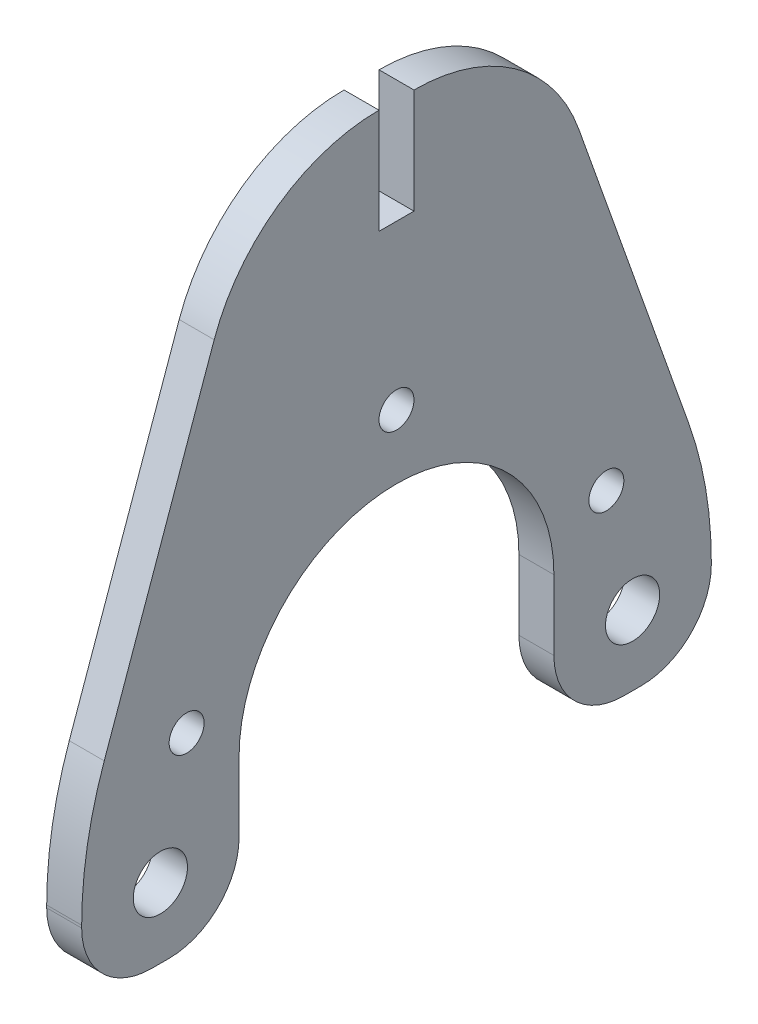
ISO-10303-21;
HEADER;
FILE_DESCRIPTION(('STEP AP214'),'2;1');
FILE_NAME('part.step','',(''),(''),'','','');
FILE_SCHEMA(('AUTOMOTIVE_DESIGN { 1 0 10303 214 1 1 1 1 }'));
ENDSEC;
DATA;
#1=APPLICATION_CONTEXT('core data for automotive mechanical design processes');
#2=APPLICATION_PROTOCOL_DEFINITION('international standard','automotive_design',2000,#1);
#3=PRODUCT_CONTEXT('',#1,'mechanical');
#4=PRODUCT('Part','Part','',(#3));
#5=PRODUCT_RELATED_PRODUCT_CATEGORY('part','',(#4));
#6=PRODUCT_DEFINITION_FORMATION('','',#4);
#7=PRODUCT_DEFINITION_CONTEXT('part definition',#1,'design');
#8=PRODUCT_DEFINITION('design','',#6,#7);
#9=PRODUCT_DEFINITION_SHAPE('','',#8);
#10=(LENGTH_UNIT() NAMED_UNIT(*) SI_UNIT(.MILLI.,.METRE.));
#11=(NAMED_UNIT(*) PLANE_ANGLE_UNIT() SI_UNIT($,.RADIAN.));
#12=(NAMED_UNIT(*) SI_UNIT($,.STERADIAN.) SOLID_ANGLE_UNIT());
#13=UNCERTAINTY_MEASURE_WITH_UNIT(LENGTH_MEASURE(1.E-05),#10,'distance_accuracy_value','');
#14=(GEOMETRIC_REPRESENTATION_CONTEXT(3) GLOBAL_UNCERTAINTY_ASSIGNED_CONTEXT((#13)) GLOBAL_UNIT_ASSIGNED_CONTEXT((#10,
#11,#12)) REPRESENTATION_CONTEXT('',''));
#15=CARTESIAN_POINT('',(0.,0.,0.));
#16=DIRECTION('',(0.,0.,1.));
#17=DIRECTION('',(1.,0.,0.));
#18=AXIS2_PLACEMENT_3D('',#15,#16,#17);
#19=CARTESIAN_POINT('',(3.175,0.,0.));
#20=DIRECTION('',(-1.,0.,0.));
#21=DIRECTION('',(0.,0.,1.));
#22=AXIS2_PLACEMENT_3D('',#19,#20,#21);
#23=CYLINDRICAL_SURFACE('',#22,14.2875);
#24=CARTESIAN_POINT('',(0.,0.,0.));
#25=DIRECTION('',(-1.,0.,0.));
#26=DIRECTION('',(0.,0.,-1.));
#27=AXIS2_PLACEMENT_3D('',#24,#25,#26);
#28=CIRCLE('',#27,14.2875);
#29=CARTESIAN_POINT('',(0.,0.,14.2875));
#30=VERTEX_POINT('',#29);
#31=CARTESIAN_POINT('',(0.,0.,-14.2875));
#32=VERTEX_POINT('',#31);
#33=EDGE_CURVE('E197',#30,#32,#28,.T.);
#34=ORIENTED_EDGE('',*,*,#33,.T.);
#35=DIRECTION('',(-1.,0.,0.));
#36=VECTOR('',#35,1.);
#37=CARTESIAN_POINT('',(3.175,0.,-14.2875));
#38=LINE('',#37,#36);
#39=CARTESIAN_POINT('',(3.175,0.,-14.2875));
#40=VERTEX_POINT('',#39);
#41=EDGE_CURVE('E181',#40,#32,#38,.T.);
#42=ORIENTED_EDGE('',*,*,#41,.F.);
#43=CARTESIAN_POINT('',(3.175,0.,0.));
#44=DIRECTION('',(-1.,0.,0.));
#45=DIRECTION('',(0.,0.,-1.));
#46=AXIS2_PLACEMENT_3D('',#43,#44,#45);
#47=CIRCLE('',#46,14.2875);
#48=CARTESIAN_POINT('',(3.175,0.,14.2875));
#49=VERTEX_POINT('',#48);
#50=EDGE_CURVE('E185',#49,#40,#47,.T.);
#51=ORIENTED_EDGE('',*,*,#50,.F.);
#52=DIRECTION('',(-1.,0.,0.));
#53=VECTOR('',#52,1.);
#54=CARTESIAN_POINT('',(3.175,0.,14.2875));
#55=LINE('',#54,#53);
#56=EDGE_CURVE('E289',#49,#30,#55,.T.);
#57=ORIENTED_EDGE('',*,*,#56,.T.);
#58=EDGE_LOOP('',(#34,#42,#51,#57));
#59=FACE_BOUND('',#58,.T.);
#60=ADVANCED_FACE('F40',(#59),#23,.F.);
#61=CARTESIAN_POINT('',(3.175,-12.7,-14.2875));
#62=DIRECTION('',(0.,0.,-1.));
#63=DIRECTION('',(0.,1.,0.));
#64=AXIS2_PLACEMENT_3D('',#61,#62,#63);
#65=PLANE('',#64);
#66=DIRECTION('',(0.,-1.,0.));
#67=VECTOR('',#66,1.);
#68=CARTESIAN_POINT('',(0.,-12.7,-14.2875));
#69=LINE('',#68,#67);
#70=CARTESIAN_POINT('',(0.,-6.35,-14.2875));
#71=VERTEX_POINT('',#70);
#72=EDGE_CURVE('E472',#32,#71,#69,.T.);
#73=ORIENTED_EDGE('',*,*,#72,.T.);
#74=DIRECTION('',(-1.,0.,0.));
#75=VECTOR('',#74,1.);
#76=CARTESIAN_POINT('',(3.175,-6.35,-14.2875));
#77=LINE('',#76,#75);
#78=CARTESIAN_POINT('',(3.175,-6.35,-14.2875));
#79=VERTEX_POINT('',#78);
#80=EDGE_CURVE('E55',#71,#79,#77,.F.);
#81=ORIENTED_EDGE('',*,*,#80,.T.);
#82=DIRECTION('',(0.,-1.,0.));
#83=VECTOR('',#82,1.);
#84=CARTESIAN_POINT('',(3.175,-12.7,-14.2875));
#85=LINE('',#84,#83);
#86=EDGE_CURVE('E177',#40,#79,#85,.T.);
#87=ORIENTED_EDGE('',*,*,#86,.F.);
#88=ORIENTED_EDGE('',*,*,#41,.T.);
#89=EDGE_LOOP('',(#73,#81,#87,#88));
#90=FACE_BOUND('',#89,.T.);
#91=ADVANCED_FACE('F179',(#90),#65,.F.);
#92=CARTESIAN_POINT('',(3.175,-12.7,-28.575));
#93=DIRECTION('',(0.,1.,0.));
#94=DIRECTION('',(0.,0.,1.));
#95=AXIS2_PLACEMENT_3D('',#92,#93,#94);
#96=PLANE('',#95);
#97=DIRECTION('',(0.,0.,-1.));
#98=VECTOR('',#97,1.);
#99=CARTESIAN_POINT('',(0.,-12.7,-28.575));
#100=LINE('',#99,#98);
#101=CARTESIAN_POINT('',(0.,-12.7,-20.6375));
#102=VERTEX_POINT('',#101);
#103=CARTESIAN_POINT('',(0.,-12.7,-22.225));
#104=VERTEX_POINT('',#103);
#105=EDGE_CURVE('E474',#102,#104,#100,.T.);
#106=ORIENTED_EDGE('',*,*,#105,.T.);
#107=DIRECTION('',(-1.,0.,0.));
#108=VECTOR('',#107,1.);
#109=CARTESIAN_POINT('',(3.175,-12.7,-22.225));
#110=LINE('',#109,#108);
#111=CARTESIAN_POINT('',(3.175,-12.7,-22.225));
#112=VERTEX_POINT('',#111);
#113=EDGE_CURVE('E239',#104,#112,#110,.F.);
#114=ORIENTED_EDGE('',*,*,#113,.T.);
#115=DIRECTION('',(0.,0.,-1.));
#116=VECTOR('',#115,1.);
#117=CARTESIAN_POINT('',(3.175,-12.7,-28.575));
#118=LINE('',#117,#116);
#119=CARTESIAN_POINT('',(3.175,-12.7,-20.6375));
#120=VERTEX_POINT('',#119);
#121=EDGE_CURVE('E184',#120,#112,#118,.T.);
#122=ORIENTED_EDGE('',*,*,#121,.F.);
#123=DIRECTION('',(-1.,0.,0.));
#124=VECTOR('',#123,1.);
#125=CARTESIAN_POINT('',(3.175,-12.7,-20.6375));
#126=LINE('',#125,#124);
#127=EDGE_CURVE('E236',#120,#102,#126,.T.);
#128=ORIENTED_EDGE('',*,*,#127,.T.);
#129=EDGE_LOOP('',(#106,#114,#122,#128));
#130=FACE_BOUND('',#129,.T.);
#131=ADVANCED_FACE('F357',(#130),#96,.F.);
#132=CARTESIAN_POINT('',(3.175,0.,-28.575));
#133=DIRECTION('',(0.,0.,1.));
#134=DIRECTION('',(0.,-1.,0.));
#135=AXIS2_PLACEMENT_3D('',#132,#133,#134);
#136=PLANE('',#135);
#137=DIRECTION('',(0.,1.,0.));
#138=VECTOR('',#137,1.);
#139=CARTESIAN_POINT('',(3.175,0.,-28.575));
#140=LINE('',#139,#138);
#141=CARTESIAN_POINT('',(3.175,-6.35,-28.575));
#142=VERTEX_POINT('',#141);
#143=CARTESIAN_POINT('',(3.175,-6.12356805758089,-28.575));
#144=VERTEX_POINT('',#143);
#145=EDGE_CURVE('E455',#142,#144,#140,.T.);
#146=ORIENTED_EDGE('',*,*,#145,.F.);
#147=DIRECTION('',(-1.,0.,0.));
#148=VECTOR('',#147,1.);
#149=CARTESIAN_POINT('',(3.175,-6.35,-28.575));
#150=LINE('',#149,#148);
#151=CARTESIAN_POINT('',(0.,-6.35,-28.575));
#152=VERTEX_POINT('',#151);
#153=EDGE_CURVE('E225',#142,#152,#150,.T.);
#154=ORIENTED_EDGE('',*,*,#153,.T.);
#155=DIRECTION('',(0.,1.,0.));
#156=VECTOR('',#155,1.);
#157=CARTESIAN_POINT('',(0.,0.,-28.575));
#158=LINE('',#157,#156);
#159=CARTESIAN_POINT('',(0.,-6.12356805758089,-28.575));
#160=VERTEX_POINT('',#159);
#161=EDGE_CURVE('E477',#152,#160,#158,.T.);
#162=ORIENTED_EDGE('',*,*,#161,.T.);
#163=DIRECTION('',(-1.,0.,0.));
#164=VECTOR('',#163,1.);
#165=CARTESIAN_POINT('',(3.175,-6.12356805758089,-28.575));
#166=LINE('',#165,#164);
#167=EDGE_CURVE('E222',#160,#144,#166,.F.);
#168=ORIENTED_EDGE('',*,*,#167,.T.);
#169=EDGE_LOOP('',(#146,#154,#162,#168));
#170=FACE_BOUND('',#169,.T.);
#171=ADVANCED_FACE('F362',(#170),#136,.F.);
#172=CARTESIAN_POINT('',(3.175,33.885007674806,-16.5480963615593));
#173=DIRECTION('',(0.,-0.334488672428725,0.942399770806885));
#174=DIRECTION('',(0.,-0.942399770806885,-0.334488672428725));
#175=AXIS2_PLACEMENT_3D('',#172,#173,#174);
#176=PLANE('',#175);
#177=DIRECTION('',(0.,0.942399770806885,0.334488672428725));
#178=VECTOR('',#177,1.);
#179=CARTESIAN_POINT('',(3.175,33.885007674806,-16.5480963615593));
#180=LINE('',#179,#178);
#181=CARTESIAN_POINT('',(3.175,5.77084913398457,-26.5267358498928));
#182=VERTEX_POINT('',#181);
#183=CARTESIAN_POINT('',(3.175,33.885007674806,-16.5480963615593));
#184=VERTEX_POINT('',#183);
#185=EDGE_CURVE('E457',#182,#184,#180,.T.);
#186=ORIENTED_EDGE('',*,*,#185,.F.);
#187=DIRECTION('',(-1.,0.,0.));
#188=VECTOR('',#187,1.);
#189=CARTESIAN_POINT('',(3.175,5.77084913398456,-26.5267358498928));
#190=LINE('',#189,#188);
#191=CARTESIAN_POINT('',(0.,5.77084913398457,-26.5267358498928));
#192=VERTEX_POINT('',#191);
#193=EDGE_CURVE('E219',#182,#192,#190,.T.);
#194=ORIENTED_EDGE('',*,*,#193,.T.);
#195=DIRECTION('',(0.,0.942399770806885,0.334488672428725));
#196=VECTOR('',#195,1.);
#197=CARTESIAN_POINT('',(0.,33.885007674806,-16.5480963615593));
#198=LINE('',#197,#196);
#199=CARTESIAN_POINT('',(0.,33.885007674806,-16.5480963615593));
#200=VERTEX_POINT('',#199);
#201=EDGE_CURVE('E322',#192,#200,#198,.T.);
#202=ORIENTED_EDGE('',*,*,#201,.T.);
#203=DIRECTION('',(-1.,0.,0.));
#204=VECTOR('',#203,1.);
#205=CARTESIAN_POINT('',(3.175,33.885007674806,-16.5480963615593));
#206=LINE('',#205,#204);
#207=EDGE_CURVE('E199',#184,#200,#206,.T.);
#208=ORIENTED_EDGE('',*,*,#207,.F.);
#209=EDGE_LOOP('',(#186,#194,#202,#208));
#210=FACE_BOUND('',#209,.T.);
#211=ADVANCED_FACE('F366',(#210),#176,.F.);
#212=CARTESIAN_POINT('',(3.175,28.575,-1.5875));
#213=DIRECTION('',(-1.,0.,0.));
#214=DIRECTION('',(0.,0.,1.));
#215=AXIS2_PLACEMENT_3D('',#212,#213,#214);
#216=CYLINDRICAL_SURFACE('',#215,15.875);
#217=CARTESIAN_POINT('',(0.,28.575,-1.5875));
#218=DIRECTION('',(1.,0.,0.));
#219=DIRECTION('',(0.,0.,-1.));
#220=AXIS2_PLACEMENT_3D('',#217,#218,#219);
#221=CIRCLE('',#220,15.875);
#222=CARTESIAN_POINT('',(0.,44.45,-1.5875));
#223=VERTEX_POINT('',#222);
#224=EDGE_CURVE('E316',#200,#223,#221,.T.);
#225=ORIENTED_EDGE('',*,*,#224,.T.);
#226=DIRECTION('',(-1.,0.,0.));
#227=VECTOR('',#226,1.);
#228=CARTESIAN_POINT('',(3.175,44.45,-1.5875));
#229=LINE('',#228,#227);
#230=CARTESIAN_POINT('',(3.175,44.45,-1.5875));
#231=VERTEX_POINT('',#230);
#232=EDGE_CURVE('E205',#231,#223,#229,.T.);
#233=ORIENTED_EDGE('',*,*,#232,.F.);
#234=CARTESIAN_POINT('',(3.175,28.575,-1.5875));
#235=DIRECTION('',(1.,0.,0.));
#236=DIRECTION('',(0.,0.,-1.));
#237=AXIS2_PLACEMENT_3D('',#234,#235,#236);
#238=CIRCLE('',#237,15.875);
#239=EDGE_CURVE('E459',#184,#231,#238,.T.);
#240=ORIENTED_EDGE('',*,*,#239,.F.);
#241=ORIENTED_EDGE('',*,*,#207,.T.);
#242=EDGE_LOOP('',(#225,#233,#240,#241));
#243=FACE_BOUND('',#242,.T.);
#244=ADVANCED_FACE('F370',(#243),#216,.T.);
#245=CARTESIAN_POINT('',(3.175,44.45,-1.5875));
#246=DIRECTION('',(0.,0.,-1.));
#247=DIRECTION('',(0.,1.,0.));
#248=AXIS2_PLACEMENT_3D('',#245,#246,#247);
#249=PLANE('',#248);
#250=DIRECTION('',(0.,-1.,0.));
#251=VECTOR('',#250,1.);
#252=CARTESIAN_POINT('',(0.,44.45,-1.5875));
#253=LINE('',#252,#251);
#254=CARTESIAN_POINT('',(0.,34.925,-1.5875));
#255=VERTEX_POINT('',#254);
#256=EDGE_CURVE('E309',#223,#255,#253,.T.);
#257=ORIENTED_EDGE('',*,*,#256,.T.);
#258=DIRECTION('',(-1.,0.,0.));
#259=VECTOR('',#258,1.);
#260=CARTESIAN_POINT('',(3.175,34.925,-1.5875));
#261=LINE('',#260,#259);
#262=CARTESIAN_POINT('',(3.175,34.925,-1.5875));
#263=VERTEX_POINT('',#262);
#264=EDGE_CURVE('E300',#263,#255,#261,.T.);
#265=ORIENTED_EDGE('',*,*,#264,.F.);
#266=DIRECTION('',(0.,-1.,0.));
#267=VECTOR('',#266,1.);
#268=CARTESIAN_POINT('',(3.175,44.45,-1.5875));
#269=LINE('',#268,#267);
#270=EDGE_CURVE('E310',#231,#263,#269,.T.);
#271=ORIENTED_EDGE('',*,*,#270,.F.);
#272=ORIENTED_EDGE('',*,*,#232,.T.);
#273=EDGE_LOOP('',(#257,#265,#271,#272));
#274=FACE_BOUND('',#273,.T.);
#275=ADVANCED_FACE('F307',(#274),#249,.F.);
#276=CARTESIAN_POINT('',(3.175,34.925,-1.5875));
#277=DIRECTION('',(0.,-1.,0.));
#278=DIRECTION('',(0.,0.,-1.));
#279=AXIS2_PLACEMENT_3D('',#276,#277,#278);
#280=PLANE('',#279);
#281=DIRECTION('',(0.,0.,1.));
#282=VECTOR('',#281,1.);
#283=CARTESIAN_POINT('',(0.,34.925,-1.5875));
#284=LINE('',#283,#282);
#285=CARTESIAN_POINT('',(0.,34.925,1.5875));
#286=VERTEX_POINT('',#285);
#287=EDGE_CURVE('E318',#255,#286,#284,.T.);
#288=ORIENTED_EDGE('',*,*,#287,.T.);
#289=DIRECTION('',(-1.,0.,0.));
#290=VECTOR('',#289,1.);
#291=CARTESIAN_POINT('',(3.175,34.925,1.5875));
#292=LINE('',#291,#290);
#293=CARTESIAN_POINT('',(3.175,34.925,1.5875));
#294=VERTEX_POINT('',#293);
#295=EDGE_CURVE('E297',#294,#286,#292,.T.);
#296=ORIENTED_EDGE('',*,*,#295,.F.);
#297=DIRECTION('',(0.,0.,1.));
#298=VECTOR('',#297,1.);
#299=CARTESIAN_POINT('',(3.175,34.925,-1.5875));
#300=LINE('',#299,#298);
#301=EDGE_CURVE('E462',#263,#294,#300,.T.);
#302=ORIENTED_EDGE('',*,*,#301,.F.);
#303=ORIENTED_EDGE('',*,*,#264,.T.);
#304=EDGE_LOOP('',(#288,#296,#302,#303));
#305=FACE_BOUND('',#304,.T.);
#306=ADVANCED_FACE('F376',(#305),#280,.F.);
#307=CARTESIAN_POINT('',(3.175,44.45,1.5875));
#308=DIRECTION('',(0.,0.,1.));
#309=DIRECTION('',(0.,-1.,0.));
#310=AXIS2_PLACEMENT_3D('',#307,#308,#309);
#311=PLANE('',#310);
#312=DIRECTION('',(0.,1.,0.));
#313=VECTOR('',#312,1.);
#314=CARTESIAN_POINT('',(0.,44.45,1.5875));
#315=LINE('',#314,#313);
#316=CARTESIAN_POINT('',(0.,44.45,1.5875));
#317=VERTEX_POINT('',#316);
#318=EDGE_CURVE('E320',#286,#317,#315,.T.);
#319=ORIENTED_EDGE('',*,*,#318,.T.);
#320=DIRECTION('',(-1.,0.,0.));
#321=VECTOR('',#320,1.);
#322=CARTESIAN_POINT('',(3.175,44.45,1.5875));
#323=LINE('',#322,#321);
#324=CARTESIAN_POINT('',(3.175,44.45,1.5875));
#325=VERTEX_POINT('',#324);
#326=EDGE_CURVE('E294',#325,#317,#323,.T.);
#327=ORIENTED_EDGE('',*,*,#326,.F.);
#328=DIRECTION('',(0.,1.,0.));
#329=VECTOR('',#328,1.);
#330=CARTESIAN_POINT('',(3.175,44.45,1.5875));
#331=LINE('',#330,#329);
#332=EDGE_CURVE('E464',#294,#325,#331,.T.);
#333=ORIENTED_EDGE('',*,*,#332,.F.);
#334=ORIENTED_EDGE('',*,*,#295,.T.);
#335=EDGE_LOOP('',(#319,#327,#333,#334));
#336=FACE_BOUND('',#335,.T.);
#337=ADVANCED_FACE('F379',(#336),#311,.F.);
#338=CARTESIAN_POINT('',(3.175,28.575,1.5875));
#339=DIRECTION('',(-1.,0.,0.));
#340=DIRECTION('',(0.,0.,1.));
#341=AXIS2_PLACEMENT_3D('',#338,#339,#340);
#342=CYLINDRICAL_SURFACE('',#341,15.875);
#343=CARTESIAN_POINT('',(0.,28.575,1.5875));
#344=DIRECTION('',(1.,0.,0.));
#345=DIRECTION('',(0.,0.,1.));
#346=AXIS2_PLACEMENT_3D('',#343,#344,#345);
#347=CIRCLE('',#346,15.875);
#348=CARTESIAN_POINT('',(0.,33.885007674806,16.5480963615593));
#349=VERTEX_POINT('',#348);
#350=EDGE_CURVE('E327',#317,#349,#347,.T.);
#351=ORIENTED_EDGE('',*,*,#350,.T.);
#352=DIRECTION('',(-1.,0.,0.));
#353=VECTOR('',#352,1.);
#354=CARTESIAN_POINT('',(3.175,33.885007674806,16.5480963615593));
#355=LINE('',#354,#353);
#356=CARTESIAN_POINT('',(3.175,33.885007674806,16.5480963615593));
#357=VERTEX_POINT('',#356);
#358=EDGE_CURVE('E291',#357,#349,#355,.T.);
#359=ORIENTED_EDGE('',*,*,#358,.F.);
#360=CARTESIAN_POINT('',(3.175,28.575,1.5875));
#361=DIRECTION('',(1.,0.,0.));
#362=DIRECTION('',(0.,0.,1.));
#363=AXIS2_PLACEMENT_3D('',#360,#361,#362);
#364=CIRCLE('',#363,15.875);
#365=EDGE_CURVE('E466',#325,#357,#364,.T.);
#366=ORIENTED_EDGE('',*,*,#365,.F.);
#367=ORIENTED_EDGE('',*,*,#326,.T.);
#368=EDGE_LOOP('',(#351,#359,#366,#367));
#369=FACE_BOUND('',#368,.T.);
#370=ADVANCED_FACE('F383',(#369),#342,.T.);
#371=CARTESIAN_POINT('',(3.175,33.885007674806,16.5480963615593));
#372=DIRECTION('',(0.,-0.334488672428725,-0.942399770806885));
#373=DIRECTION('',(0.,0.942399770806885,-0.334488672428725));
#374=AXIS2_PLACEMENT_3D('',#371,#372,#373);
#375=PLANE('',#374);
#376=DIRECTION('',(0.,-0.942399770806885,0.334488672428725));
#377=VECTOR('',#376,1.);
#378=CARTESIAN_POINT('',(0.,33.885007674806,16.5480963615593));
#379=LINE('',#378,#377);
#380=CARTESIAN_POINT('',(0.,5.77084913398457,26.5267358498928));
#381=VERTEX_POINT('',#380);
#382=EDGE_CURVE('E285',#349,#381,#379,.T.);
#383=ORIENTED_EDGE('',*,*,#382,.T.);
#384=DIRECTION('',(-1.,0.,0.));
#385=VECTOR('',#384,1.);
#386=CARTESIAN_POINT('',(3.175,5.77084913398456,26.5267358498928));
#387=LINE('',#386,#385);
#388=CARTESIAN_POINT('',(3.175,5.77084913398457,26.5267358498928));
#389=VERTEX_POINT('',#388);
#390=EDGE_CURVE('E213',#381,#389,#387,.F.);
#391=ORIENTED_EDGE('',*,*,#390,.T.);
#392=DIRECTION('',(0.,-0.942399770806885,0.334488672428725));
#393=VECTOR('',#392,1.);
#394=CARTESIAN_POINT('',(3.175,33.885007674806,16.5480963615593));
#395=LINE('',#394,#393);
#396=EDGE_CURVE('E269',#357,#389,#395,.T.);
#397=ORIENTED_EDGE('',*,*,#396,.F.);
#398=ORIENTED_EDGE('',*,*,#358,.T.);
#399=EDGE_LOOP('',(#383,#391,#397,#398));
#400=FACE_BOUND('',#399,.T.);
#401=ADVANCED_FACE('F332',(#400),#375,.F.);
#402=CARTESIAN_POINT('',(3.175,-12.7,28.575));
#403=DIRECTION('',(0.,0.,-1.));
#404=DIRECTION('',(0.,1.,0.));
#405=AXIS2_PLACEMENT_3D('',#402,#403,#404);
#406=PLANE('',#405);
#407=DIRECTION('',(0.,-1.,0.));
#408=VECTOR('',#407,1.);
#409=CARTESIAN_POINT('',(0.,-12.7,28.575));
#410=LINE('',#409,#408);
#411=CARTESIAN_POINT('',(0.,-6.1235680575809,28.575));
#412=VERTEX_POINT('',#411);
#413=CARTESIAN_POINT('',(0.,-6.35,28.575));
#414=VERTEX_POINT('',#413);
#415=EDGE_CURVE('E262',#412,#414,#410,.T.);
#416=ORIENTED_EDGE('',*,*,#415,.T.);
#417=DIRECTION('',(-1.,0.,0.));
#418=VECTOR('',#417,1.);
#419=CARTESIAN_POINT('',(3.175,-6.35,28.575));
#420=LINE('',#419,#418);
#421=CARTESIAN_POINT('',(3.175,-6.35,28.575));
#422=VERTEX_POINT('',#421);
#423=EDGE_CURVE('E48',#414,#422,#420,.F.);
#424=ORIENTED_EDGE('',*,*,#423,.T.);
#425=DIRECTION('',(0.,-1.,0.));
#426=VECTOR('',#425,1.);
#427=CARTESIAN_POINT('',(3.175,-12.7,28.575));
#428=LINE('',#427,#426);
#429=CARTESIAN_POINT('',(3.175,-6.1235680575809,28.575));
#430=VERTEX_POINT('',#429);
#431=EDGE_CURVE('E259',#430,#422,#428,.T.);
#432=ORIENTED_EDGE('',*,*,#431,.F.);
#433=DIRECTION('',(-1.,0.,0.));
#434=VECTOR('',#433,1.);
#435=CARTESIAN_POINT('',(3.175,-6.1235680575809,28.575));
#436=LINE('',#435,#434);
#437=EDGE_CURVE('E198',#430,#412,#436,.T.);
#438=ORIENTED_EDGE('',*,*,#437,.T.);
#439=EDGE_LOOP('',(#416,#424,#432,#438));
#440=FACE_BOUND('',#439,.T.);
#441=ADVANCED_FACE('F258',(#440),#406,.F.);
#442=CARTESIAN_POINT('',(3.175,-12.7,14.2875));
#443=DIRECTION('',(0.,1.,0.));
#444=DIRECTION('',(0.,0.,1.));
#445=AXIS2_PLACEMENT_3D('',#442,#443,#444);
#446=PLANE('',#445);
#447=DIRECTION('',(0.,0.,-1.));
#448=VECTOR('',#447,1.);
#449=CARTESIAN_POINT('',(3.175,-12.7,14.2875));
#450=LINE('',#449,#448);
#451=CARTESIAN_POINT('',(3.175,-12.7,22.225));
#452=VERTEX_POINT('',#451);
#453=CARTESIAN_POINT('',(3.175,-12.7,20.6375));
#454=VERTEX_POINT('',#453);
#455=EDGE_CURVE('E268',#452,#454,#450,.T.);
#456=ORIENTED_EDGE('',*,*,#455,.F.);
#457=DIRECTION('',(-1.,0.,0.));
#458=VECTOR('',#457,1.);
#459=CARTESIAN_POINT('',(3.175,-12.7,22.225));
#460=LINE('',#459,#458);
#461=CARTESIAN_POINT('',(0.,-12.7,22.225));
#462=VERTEX_POINT('',#461);
#463=EDGE_CURVE('E251',#452,#462,#460,.T.);
#464=ORIENTED_EDGE('',*,*,#463,.T.);
#465=DIRECTION('',(0.,0.,-1.));
#466=VECTOR('',#465,1.);
#467=CARTESIAN_POINT('',(0.,-12.7,14.2875));
#468=LINE('',#467,#466);
#469=CARTESIAN_POINT('',(0.,-12.7,20.6375));
#470=VERTEX_POINT('',#469);
#471=EDGE_CURVE('E277',#462,#470,#468,.T.);
#472=ORIENTED_EDGE('',*,*,#471,.T.);
#473=DIRECTION('',(-1.,0.,0.));
#474=VECTOR('',#473,1.);
#475=CARTESIAN_POINT('',(3.175,-12.7,20.6375));
#476=LINE('',#475,#474);
#477=EDGE_CURVE('E249',#470,#454,#476,.F.);
#478=ORIENTED_EDGE('',*,*,#477,.T.);
#479=EDGE_LOOP('',(#456,#464,#472,#478));
#480=FACE_BOUND('',#479,.T.);
#481=ADVANCED_FACE('F276',(#480),#446,.F.);
#482=CARTESIAN_POINT('',(3.175,0.,14.2875));
#483=DIRECTION('',(0.,0.,1.));
#484=DIRECTION('',(0.,-1.,0.));
#485=AXIS2_PLACEMENT_3D('',#482,#483,#484);
#486=PLANE('',#485);
#487=DIRECTION('',(0.,1.,0.));
#488=VECTOR('',#487,1.);
#489=CARTESIAN_POINT('',(3.175,0.,14.2875));
#490=LINE('',#489,#488);
#491=CARTESIAN_POINT('',(3.175,-6.35,14.2875));
#492=VERTEX_POINT('',#491);
#493=EDGE_CURVE('E190',#492,#49,#490,.T.);
#494=ORIENTED_EDGE('',*,*,#493,.F.);
#495=DIRECTION('',(-1.,0.,0.));
#496=VECTOR('',#495,1.);
#497=CARTESIAN_POINT('',(3.175,-6.35,14.2875));
#498=LINE('',#497,#496);
#499=CARTESIAN_POINT('',(0.,-6.35,14.2875));
#500=VERTEX_POINT('',#499);
#501=EDGE_CURVE('E11',#492,#500,#498,.T.);
#502=ORIENTED_EDGE('',*,*,#501,.T.);
#503=DIRECTION('',(0.,1.,0.));
#504=VECTOR('',#503,1.);
#505=CARTESIAN_POINT('',(0.,0.,14.2875));
#506=LINE('',#505,#504);
#507=EDGE_CURVE('E194',#500,#30,#506,.T.);
#508=ORIENTED_EDGE('',*,*,#507,.T.);
#509=ORIENTED_EDGE('',*,*,#56,.F.);
#510=EDGE_LOOP('',(#494,#502,#508,#509));
#511=FACE_BOUND('',#510,.T.);
#512=ADVANCED_FACE('F394',(#511),#486,.F.);
#513=CARTESIAN_POINT('',(3.175,0.,0.));
#514=DIRECTION('',(1.,0.,0.));
#515=DIRECTION('',(0.,0.,-1.));
#516=AXIS2_PLACEMENT_3D('',#513,#514,#515);
#517=PLANE('',#516);
#518=CARTESIAN_POINT('',(3.175,20.09775,0.));
#519=DIRECTION('',(1.,0.,0.));
#520=DIRECTION('',(0.,0.,-1.));
#521=AXIS2_PLACEMENT_3D('',#518,#519,#520);
#522=CIRCLE('',#521,1.5875);
#523=CARTESIAN_POINT('',(3.175,20.09775,-1.58749999999999));
#524=VERTEX_POINT('',#523);
#525=EDGE_CURVE('E428',#524,#524,#522,.T.);
#526=ORIENTED_EDGE('',*,*,#525,.F.);
#527=EDGE_LOOP('',(#526));
#528=FACE_BOUND('',#527,.T.);
#529=CARTESIAN_POINT('',(3.175,4.22274999999999,19.0488710219009));
#530=DIRECTION('',(1.,0.,0.));
#531=DIRECTION('',(0.,0.,-1.));
#532=AXIS2_PLACEMENT_3D('',#529,#530,#531);
#533=CIRCLE('',#532,1.5875);
#534=CARTESIAN_POINT('',(3.175,4.22274999999999,17.4613710219009));
#535=VERTEX_POINT('',#534);
#536=EDGE_CURVE('E426',#535,#535,#533,.T.);
#537=ORIENTED_EDGE('',*,*,#536,.F.);
#538=EDGE_LOOP('',(#537));
#539=FACE_BOUND('',#538,.T.);
#540=CARTESIAN_POINT('',(3.175,4.22275000000001,-19.0488710219009));
#541=DIRECTION('',(1.,0.,0.));
#542=DIRECTION('',(0.,0.,-1.));
#543=AXIS2_PLACEMENT_3D('',#540,#541,#542);
#544=CIRCLE('',#543,1.5875);
#545=CARTESIAN_POINT('',(3.175,4.22275000000001,-20.6363710219009));
#546=VERTEX_POINT('',#545);
#547=EDGE_CURVE('E433',#546,#546,#544,.T.);
#548=ORIENTED_EDGE('',*,*,#547,.F.);
#549=EDGE_LOOP('',(#548));
#550=FACE_BOUND('',#549,.T.);
#551=CARTESIAN_POINT('',(3.175,-6.35,-21.43125));
#552=DIRECTION('',(1.,0.,0.));
#553=DIRECTION('',(0.,0.,-1.));
#554=AXIS2_PLACEMENT_3D('',#551,#552,#553);
#555=CIRCLE('',#554,2.45744999999999);
#556=CARTESIAN_POINT('',(3.175,-6.35,-23.8887));
#557=VERTEX_POINT('',#556);
#558=EDGE_CURVE('E445',#557,#557,#555,.T.);
#559=ORIENTED_EDGE('',*,*,#558,.F.);
#560=EDGE_LOOP('',(#559));
#561=FACE_BOUND('',#560,.T.);
#562=CARTESIAN_POINT('',(3.175,-6.34999999999999,21.43125));
#563=DIRECTION('',(1.,0.,0.));
#564=DIRECTION('',(0.,0.,-1.));
#565=AXIS2_PLACEMENT_3D('',#562,#563,#564);
#566=CIRCLE('',#565,2.45744999999999);
#567=CARTESIAN_POINT('',(3.175,-6.34999999999999,18.9738));
#568=VERTEX_POINT('',#567);
#569=EDGE_CURVE('E451',#568,#568,#566,.T.);
#570=ORIENTED_EDGE('',*,*,#569,.F.);
#571=EDGE_LOOP('',(#570));
#572=FACE_BOUND('',#571,.T.);
#573=ORIENTED_EDGE('',*,*,#121,.T.);
#574=CARTESIAN_POINT('',(3.175,-6.35,-22.225));
#575=DIRECTION('',(1.,0.,0.));
#576=DIRECTION('',(0.,0.,-1.));
#577=AXIS2_PLACEMENT_3D('',#574,#575,#576);
#578=CIRCLE('',#577,6.35);
#579=EDGE_CURVE('E246',#112,#142,#578,.T.);
#580=ORIENTED_EDGE('',*,*,#579,.T.);
#581=ORIENTED_EDGE('',*,*,#145,.T.);
#582=CARTESIAN_POINT('',(3.175,-6.12356805758088,6.98499999999999));
#583=DIRECTION('',(1.,0.,0.));
#584=DIRECTION('',(0.,0.,-1.));
#585=AXIS2_PLACEMENT_3D('',#582,#583,#584);
#586=CIRCLE('',#585,35.56);
#587=EDGE_CURVE('E215',#144,#182,#586,.T.);
#588=ORIENTED_EDGE('',*,*,#587,.T.);
#589=ORIENTED_EDGE('',*,*,#185,.T.);
#590=ORIENTED_EDGE('',*,*,#239,.T.);
#591=ORIENTED_EDGE('',*,*,#270,.T.);
#592=ORIENTED_EDGE('',*,*,#301,.T.);
#593=ORIENTED_EDGE('',*,*,#332,.T.);
#594=ORIENTED_EDGE('',*,*,#365,.T.);
#595=ORIENTED_EDGE('',*,*,#396,.T.);
#596=CARTESIAN_POINT('',(3.175,-6.12356805758089,-6.98499999999999));
#597=DIRECTION('',(1.,0.,0.));
#598=DIRECTION('',(0.,0.,-1.));
#599=AXIS2_PLACEMENT_3D('',#596,#597,#598);
#600=CIRCLE('',#599,35.56);
#601=EDGE_CURVE('E217',#389,#430,#600,.T.);
#602=ORIENTED_EDGE('',*,*,#601,.T.);
#603=ORIENTED_EDGE('',*,*,#431,.T.);
#604=CARTESIAN_POINT('',(3.175,-6.35,22.225));
#605=DIRECTION('',(1.,0.,0.));
#606=DIRECTION('',(0.,0.,-1.));
#607=AXIS2_PLACEMENT_3D('',#604,#605,#606);
#608=CIRCLE('',#607,6.35);
#609=EDGE_CURVE('E242',#422,#452,#608,.T.);
#610=ORIENTED_EDGE('',*,*,#609,.T.);
#611=ORIENTED_EDGE('',*,*,#455,.T.);
#612=CARTESIAN_POINT('',(3.175,-6.35,20.6375));
#613=DIRECTION('',(1.,0.,0.));
#614=DIRECTION('',(0.,0.,-1.));
#615=AXIS2_PLACEMENT_3D('',#612,#613,#614);
#616=CIRCLE('',#615,6.35);
#617=EDGE_CURVE('E63',#454,#492,#616,.T.);
#618=ORIENTED_EDGE('',*,*,#617,.T.);
#619=ORIENTED_EDGE('',*,*,#493,.T.);
#620=ORIENTED_EDGE('',*,*,#50,.T.);
#621=ORIENTED_EDGE('',*,*,#86,.T.);
#622=CARTESIAN_POINT('',(3.175,-6.35,-20.6375));
#623=DIRECTION('',(1.,0.,0.));
#624=DIRECTION('',(0.,0.,-1.));
#625=AXIS2_PLACEMENT_3D('',#622,#623,#624);
#626=CIRCLE('',#625,6.35);
#627=EDGE_CURVE('E244',#79,#120,#626,.T.);
#628=ORIENTED_EDGE('',*,*,#627,.T.);
#629=EDGE_LOOP('',(#573,#580,#581,#588,#589,#590,#591,#592,#593,#594,#595,#602,#603,#610,#611,
#618,#619,#620,#621,#628));
#630=FACE_BOUND('',#629,.T.);
#631=ADVANCED_FACE('F189',(#528,#539,#550,#561,#572,#630),#517,.T.);
#632=CARTESIAN_POINT('',(0.,0.,0.));
#633=DIRECTION('',(1.,0.,0.));
#634=DIRECTION('',(0.,0.,-1.));
#635=AXIS2_PLACEMENT_3D('',#632,#633,#634);
#636=PLANE('',#635);
#637=CARTESIAN_POINT('',(0.,20.09775,0.));
#638=DIRECTION('',(1.,0.,0.));
#639=DIRECTION('',(0.,0.,-1.));
#640=AXIS2_PLACEMENT_3D('',#637,#638,#639);
#641=CIRCLE('',#640,1.5875);
#642=CARTESIAN_POINT('',(0.,20.09775,-1.58749999999999));
#643=VERTEX_POINT('',#642);
#644=EDGE_CURVE('E431',#643,#643,#641,.T.);
#645=ORIENTED_EDGE('',*,*,#644,.T.);
#646=EDGE_LOOP('',(#645));
#647=FACE_BOUND('',#646,.T.);
#648=CARTESIAN_POINT('',(0.,4.22274999999999,19.0488710219009));
#649=DIRECTION('',(1.,0.,0.));
#650=DIRECTION('',(0.,0.,-1.));
#651=AXIS2_PLACEMENT_3D('',#648,#649,#650);
#652=CIRCLE('',#651,1.5875);
#653=CARTESIAN_POINT('',(0.,4.22274999999999,17.4613710219009));
#654=VERTEX_POINT('',#653);
#655=EDGE_CURVE('E423',#654,#654,#652,.T.);
#656=ORIENTED_EDGE('',*,*,#655,.T.);
#657=EDGE_LOOP('',(#656));
#658=FACE_BOUND('',#657,.T.);
#659=CARTESIAN_POINT('',(0.,4.22275000000001,-19.0488710219009));
#660=DIRECTION('',(1.,0.,0.));
#661=DIRECTION('',(0.,0.,-1.));
#662=AXIS2_PLACEMENT_3D('',#659,#660,#661);
#663=CIRCLE('',#662,1.5875);
#664=CARTESIAN_POINT('',(0.,4.22275000000001,-20.6363710219009));
#665=VERTEX_POINT('',#664);
#666=EDGE_CURVE('E439',#665,#665,#663,.T.);
#667=ORIENTED_EDGE('',*,*,#666,.T.);
#668=EDGE_LOOP('',(#667));
#669=FACE_BOUND('',#668,.T.);
#670=CARTESIAN_POINT('',(0.,-6.35,-21.43125));
#671=DIRECTION('',(-1.,0.,0.));
#672=DIRECTION('',(0.,0.,1.));
#673=AXIS2_PLACEMENT_3D('',#670,#671,#672);
#674=CIRCLE('',#673,2.45744999999999);
#675=CARTESIAN_POINT('',(0.,-6.35,-18.9738));
#676=VERTEX_POINT('',#675);
#677=EDGE_CURVE('E442',#676,#676,#674,.T.);
#678=ORIENTED_EDGE('',*,*,#677,.F.);
#679=EDGE_LOOP('',(#678));
#680=FACE_BOUND('',#679,.T.);
#681=CARTESIAN_POINT('',(0.,-6.34999999999999,21.43125));
#682=DIRECTION('',(-1.,0.,0.));
#683=DIRECTION('',(0.,0.,1.));
#684=AXIS2_PLACEMENT_3D('',#681,#682,#683);
#685=CIRCLE('',#684,2.45744999999999);
#686=CARTESIAN_POINT('',(0.,-6.34999999999999,23.8887));
#687=VERTEX_POINT('',#686);
#688=EDGE_CURVE('E448',#687,#687,#685,.T.);
#689=ORIENTED_EDGE('',*,*,#688,.F.);
#690=EDGE_LOOP('',(#689));
#691=FACE_BOUND('',#690,.T.);
#692=ORIENTED_EDGE('',*,*,#161,.F.);
#693=CARTESIAN_POINT('',(0.,-6.35,-22.225));
#694=DIRECTION('',(1.,0.,0.));
#695=DIRECTION('',(0.,0.,-1.));
#696=AXIS2_PLACEMENT_3D('',#693,#694,#695);
#697=CIRCLE('',#696,6.35);
#698=EDGE_CURVE('E234',#152,#104,#697,.F.);
#699=ORIENTED_EDGE('',*,*,#698,.T.);
#700=ORIENTED_EDGE('',*,*,#105,.F.);
#701=CARTESIAN_POINT('',(0.,-6.35,-20.6375));
#702=DIRECTION('',(1.,0.,0.));
#703=DIRECTION('',(0.,0.,-1.));
#704=AXIS2_PLACEMENT_3D('',#701,#702,#703);
#705=CIRCLE('',#704,6.35);
#706=EDGE_CURVE('E232',#102,#71,#705,.F.);
#707=ORIENTED_EDGE('',*,*,#706,.T.);
#708=ORIENTED_EDGE('',*,*,#72,.F.);
#709=ORIENTED_EDGE('',*,*,#33,.F.);
#710=ORIENTED_EDGE('',*,*,#507,.F.);
#711=CARTESIAN_POINT('',(0.,-6.35,20.6375));
#712=DIRECTION('',(1.,0.,0.));
#713=DIRECTION('',(0.,0.,-1.));
#714=AXIS2_PLACEMENT_3D('',#711,#712,#713);
#715=CIRCLE('',#714,6.35);
#716=EDGE_CURVE('E228',#500,#470,#715,.F.);
#717=ORIENTED_EDGE('',*,*,#716,.T.);
#718=ORIENTED_EDGE('',*,*,#471,.F.);
#719=CARTESIAN_POINT('',(0.,-6.35,22.225));
#720=DIRECTION('',(1.,0.,0.));
#721=DIRECTION('',(0.,0.,-1.));
#722=AXIS2_PLACEMENT_3D('',#719,#720,#721);
#723=CIRCLE('',#722,6.35);
#724=EDGE_CURVE('E230',#462,#414,#723,.F.);
#725=ORIENTED_EDGE('',*,*,#724,.T.);
#726=ORIENTED_EDGE('',*,*,#415,.F.);
#727=CARTESIAN_POINT('',(0.,-6.12356805758089,-6.98499999999999));
#728=DIRECTION('',(1.,0.,0.));
#729=DIRECTION('',(0.,0.,-1.));
#730=AXIS2_PLACEMENT_3D('',#727,#728,#729);
#731=CIRCLE('',#730,35.56);
#732=EDGE_CURVE('E211',#412,#381,#731,.F.);
#733=ORIENTED_EDGE('',*,*,#732,.T.);
#734=ORIENTED_EDGE('',*,*,#382,.F.);
#735=ORIENTED_EDGE('',*,*,#350,.F.);
#736=ORIENTED_EDGE('',*,*,#318,.F.);
#737=ORIENTED_EDGE('',*,*,#287,.F.);
#738=ORIENTED_EDGE('',*,*,#256,.F.);
#739=ORIENTED_EDGE('',*,*,#224,.F.);
#740=ORIENTED_EDGE('',*,*,#201,.F.);
#741=CARTESIAN_POINT('',(0.,-6.12356805758088,6.98499999999999));
#742=DIRECTION('',(1.,0.,0.));
#743=DIRECTION('',(0.,0.,-1.));
#744=AXIS2_PLACEMENT_3D('',#741,#742,#743);
#745=CIRCLE('',#744,35.56);
#746=EDGE_CURVE('E202',#192,#160,#745,.F.);
#747=ORIENTED_EDGE('',*,*,#746,.T.);
#748=EDGE_LOOP('',(#692,#699,#700,#707,#708,#709,#710,#717,#718,#725,#726,#733,#734,#735,#736,
#737,#738,#739,#740,#747));
#749=FACE_BOUND('',#748,.T.);
#750=ADVANCED_FACE('F281',(#647,#658,#669,#680,#691,#749),#636,.F.);
#751=CARTESIAN_POINT('',(0.,-6.34999999999999,21.43125));
#752=DIRECTION('',(-1.,0.,0.));
#753=DIRECTION('',(0.,0.,1.));
#754=AXIS2_PLACEMENT_3D('',#751,#752,#753);
#755=CYLINDRICAL_SURFACE('',#754,2.45744999999999);
#756=ORIENTED_EDGE('',*,*,#569,.T.);
#757=EDGE_LOOP('',(#756));
#758=FACE_BOUND('',#757,.T.);
#759=ORIENTED_EDGE('',*,*,#688,.T.);
#760=EDGE_LOOP('',(#759));
#761=FACE_BOUND('',#760,.T.);
#762=ADVANCED_FACE('F400',(#758,#761),#755,.F.);
#763=CARTESIAN_POINT('',(0.,-6.35,-21.43125));
#764=DIRECTION('',(-1.,0.,0.));
#765=DIRECTION('',(0.,0.,1.));
#766=AXIS2_PLACEMENT_3D('',#763,#764,#765);
#767=CYLINDRICAL_SURFACE('',#766,2.45744999999999);
#768=ORIENTED_EDGE('',*,*,#558,.T.);
#769=EDGE_LOOP('',(#768));
#770=FACE_BOUND('',#769,.T.);
#771=ORIENTED_EDGE('',*,*,#677,.T.);
#772=EDGE_LOOP('',(#771));
#773=FACE_BOUND('',#772,.T.);
#774=ADVANCED_FACE('F407',(#770,#773),#767,.F.);
#775=CARTESIAN_POINT('',(0.,4.22275000000001,-19.0488710219009));
#776=DIRECTION('',(1.,0.,0.));
#777=DIRECTION('',(0.,0.,-1.));
#778=AXIS2_PLACEMENT_3D('',#775,#776,#777);
#779=CYLINDRICAL_SURFACE('',#778,1.5875);
#780=ORIENTED_EDGE('',*,*,#666,.F.);
#781=EDGE_LOOP('',(#780));
#782=FACE_BOUND('',#781,.T.);
#783=ORIENTED_EDGE('',*,*,#547,.T.);
#784=EDGE_LOOP('',(#783));
#785=FACE_BOUND('',#784,.T.);
#786=ADVANCED_FACE('F411',(#782,#785),#779,.F.);
#787=CARTESIAN_POINT('',(0.,4.22274999999999,19.0488710219009));
#788=DIRECTION('',(1.,0.,0.));
#789=DIRECTION('',(0.,0.,-1.));
#790=AXIS2_PLACEMENT_3D('',#787,#788,#789);
#791=CYLINDRICAL_SURFACE('',#790,1.5875);
#792=ORIENTED_EDGE('',*,*,#655,.F.);
#793=EDGE_LOOP('',(#792));
#794=FACE_BOUND('',#793,.T.);
#795=ORIENTED_EDGE('',*,*,#536,.T.);
#796=EDGE_LOOP('',(#795));
#797=FACE_BOUND('',#796,.T.);
#798=ADVANCED_FACE('F349',(#794,#797),#791,.F.);
#799=CARTESIAN_POINT('',(0.,20.09775,0.));
#800=DIRECTION('',(1.,0.,0.));
#801=DIRECTION('',(0.,0.,-1.));
#802=AXIS2_PLACEMENT_3D('',#799,#800,#801);
#803=CYLINDRICAL_SURFACE('',#802,1.5875);
#804=ORIENTED_EDGE('',*,*,#644,.F.);
#805=EDGE_LOOP('',(#804));
#806=FACE_BOUND('',#805,.T.);
#807=ORIENTED_EDGE('',*,*,#525,.T.);
#808=EDGE_LOOP('',(#807));
#809=FACE_BOUND('',#808,.T.);
#810=ADVANCED_FACE('F340',(#806,#809),#803,.F.);
#811=CARTESIAN_POINT('',(3.175,-6.12356805758089,-6.98499999999999));
#812=DIRECTION('',(-1.,0.,0.));
#813=DIRECTION('',(0.,0.,1.));
#814=AXIS2_PLACEMENT_3D('',#811,#812,#813);
#815=CYLINDRICAL_SURFACE('',#814,35.56);
#816=ORIENTED_EDGE('',*,*,#601,.F.);
#817=ORIENTED_EDGE('',*,*,#390,.F.);
#818=ORIENTED_EDGE('',*,*,#732,.F.);
#819=ORIENTED_EDGE('',*,*,#437,.F.);
#820=EDGE_LOOP('',(#816,#817,#818,#819));
#821=FACE_BOUND('',#820,.T.);
#822=ADVANCED_FACE('F337',(#821),#815,.T.);
#823=CARTESIAN_POINT('',(3.175,-6.12356805758088,6.98499999999999));
#824=DIRECTION('',(-1.,0.,0.));
#825=DIRECTION('',(0.,0.,1.));
#826=AXIS2_PLACEMENT_3D('',#823,#824,#825);
#827=CYLINDRICAL_SURFACE('',#826,35.56);
#828=ORIENTED_EDGE('',*,*,#587,.F.);
#829=ORIENTED_EDGE('',*,*,#167,.F.);
#830=ORIENTED_EDGE('',*,*,#746,.F.);
#831=ORIENTED_EDGE('',*,*,#193,.F.);
#832=EDGE_LOOP('',(#828,#829,#830,#831));
#833=FACE_BOUND('',#832,.T.);
#834=ADVANCED_FACE('F339',(#833),#827,.T.);
#835=CARTESIAN_POINT('',(3.175,-6.35,-22.225));
#836=DIRECTION('',(-1.,0.,0.));
#837=DIRECTION('',(0.,0.,1.));
#838=AXIS2_PLACEMENT_3D('',#835,#836,#837);
#839=CYLINDRICAL_SURFACE('',#838,6.35);
#840=ORIENTED_EDGE('',*,*,#579,.F.);
#841=ORIENTED_EDGE('',*,*,#113,.F.);
#842=ORIENTED_EDGE('',*,*,#698,.F.);
#843=ORIENTED_EDGE('',*,*,#153,.F.);
#844=EDGE_LOOP('',(#840,#841,#842,#843));
#845=FACE_BOUND('',#844,.T.);
#846=ADVANCED_FACE('F346',(#845),#839,.T.);
#847=CARTESIAN_POINT('',(3.175,-6.35,-20.6375));
#848=DIRECTION('',(-1.,0.,0.));
#849=DIRECTION('',(0.,0.,1.));
#850=AXIS2_PLACEMENT_3D('',#847,#848,#849);
#851=CYLINDRICAL_SURFACE('',#850,6.35);
#852=ORIENTED_EDGE('',*,*,#627,.F.);
#853=ORIENTED_EDGE('',*,*,#80,.F.);
#854=ORIENTED_EDGE('',*,*,#706,.F.);
#855=ORIENTED_EDGE('',*,*,#127,.F.);
#856=EDGE_LOOP('',(#852,#853,#854,#855));
#857=FACE_BOUND('',#856,.T.);
#858=ADVANCED_FACE('F492',(#857),#851,.T.);
#859=CARTESIAN_POINT('',(3.175,-6.35,22.225));
#860=DIRECTION('',(-1.,0.,0.));
#861=DIRECTION('',(0.,0.,1.));
#862=AXIS2_PLACEMENT_3D('',#859,#860,#861);
#863=CYLINDRICAL_SURFACE('',#862,6.35);
#864=ORIENTED_EDGE('',*,*,#609,.F.);
#865=ORIENTED_EDGE('',*,*,#423,.F.);
#866=ORIENTED_EDGE('',*,*,#724,.F.);
#867=ORIENTED_EDGE('',*,*,#463,.F.);
#868=EDGE_LOOP('',(#864,#865,#866,#867));
#869=FACE_BOUND('',#868,.T.);
#870=ADVANCED_FACE('F272',(#869),#863,.T.);
#871=CARTESIAN_POINT('',(3.175,-6.35,20.6375));
#872=DIRECTION('',(-1.,0.,0.));
#873=DIRECTION('',(0.,0.,1.));
#874=AXIS2_PLACEMENT_3D('',#871,#872,#873);
#875=CYLINDRICAL_SURFACE('',#874,6.35);
#876=ORIENTED_EDGE('',*,*,#617,.F.);
#877=ORIENTED_EDGE('',*,*,#477,.F.);
#878=ORIENTED_EDGE('',*,*,#716,.F.);
#879=ORIENTED_EDGE('',*,*,#501,.F.);
#880=EDGE_LOOP('',(#876,#877,#878,#879));
#881=FACE_BOUND('',#880,.T.);
#882=ADVANCED_FACE('F42',(#881),#875,.T.);
#883=CLOSED_SHELL('',(#60,#91,#131,#171,#211,#244,#275,#306,#337,#370,#401,#441,#481,#512,#631,
#750,#762,#774,#786,#798,#810,#822,#834,#846,#858,#870,#882));
#884=MANIFOLD_SOLID_BREP('B2',#883);
#885=ADVANCED_BREP_SHAPE_REPRESENTATION('',(#18,#884),#14);
#886=SHAPE_DEFINITION_REPRESENTATION(#9,#885);
ENDSEC;
END-ISO-10303-21;
